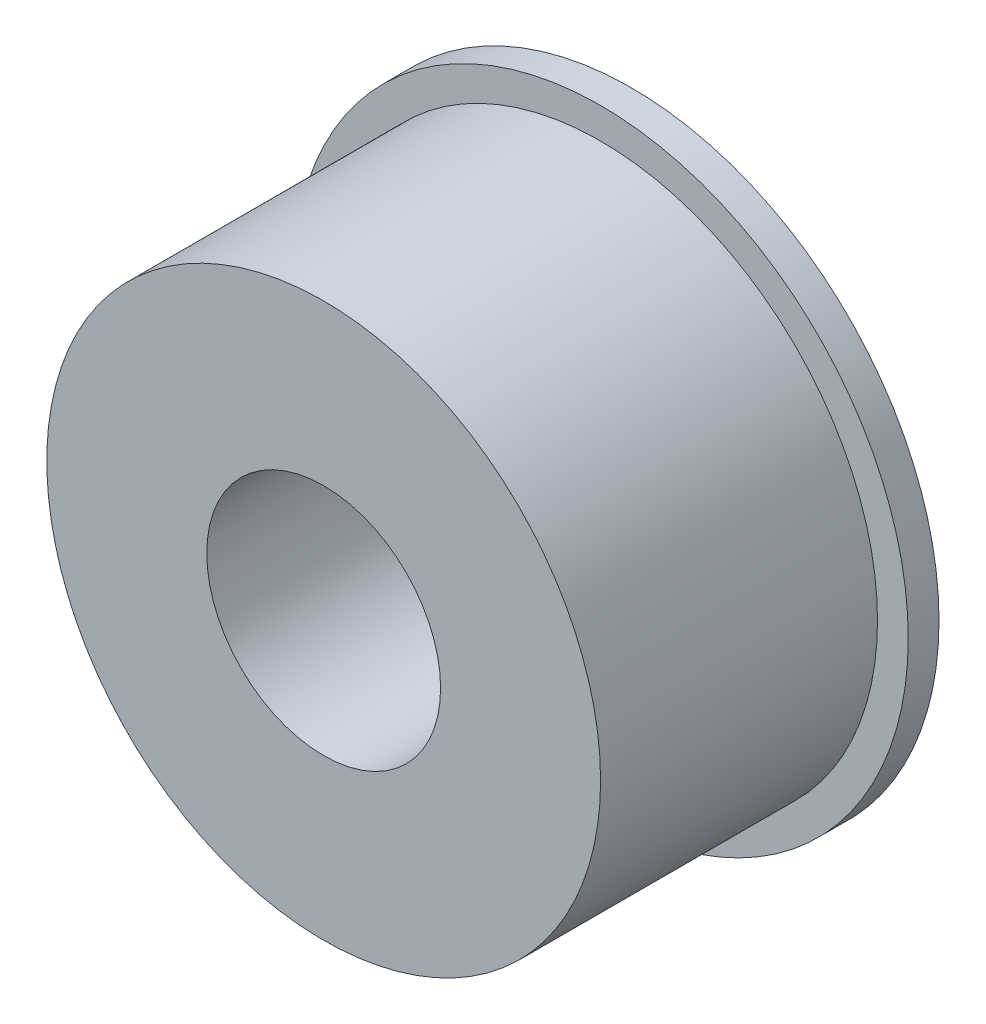
ISO-10303-21;
HEADER;
FILE_DESCRIPTION(('STEP AP214'),'2;1');
FILE_NAME('part.step','',(''),(''),'','','');
FILE_SCHEMA(('AUTOMOTIVE_DESIGN { 1 0 10303 214 1 1 1 1 }'));
ENDSEC;
DATA;
#1=APPLICATION_CONTEXT('core data for automotive mechanical design processes');
#2=APPLICATION_PROTOCOL_DEFINITION('international standard','automotive_design',2000,#1);
#3=PRODUCT_CONTEXT('',#1,'mechanical');
#4=PRODUCT('Part','Part','',(#3));
#5=PRODUCT_RELATED_PRODUCT_CATEGORY('part','',(#4));
#6=PRODUCT_DEFINITION_FORMATION('','',#4);
#7=PRODUCT_DEFINITION_CONTEXT('part definition',#1,'design');
#8=PRODUCT_DEFINITION('design','',#6,#7);
#9=PRODUCT_DEFINITION_SHAPE('','',#8);
#10=(LENGTH_UNIT() NAMED_UNIT(*) SI_UNIT(.MILLI.,.METRE.));
#11=(NAMED_UNIT(*) PLANE_ANGLE_UNIT() SI_UNIT($,.RADIAN.));
#12=(NAMED_UNIT(*) SI_UNIT($,.STERADIAN.) SOLID_ANGLE_UNIT());
#13=UNCERTAINTY_MEASURE_WITH_UNIT(LENGTH_MEASURE(1.E-05),#10,'distance_accuracy_value','');
#14=(GEOMETRIC_REPRESENTATION_CONTEXT(3) GLOBAL_UNCERTAINTY_ASSIGNED_CONTEXT((#13)) GLOBAL_UNIT_ASSIGNED_CONTEXT((#10,
#11,#12)) REPRESENTATION_CONTEXT('',''));
#15=CARTESIAN_POINT('',(0.,0.,0.));
#16=DIRECTION('',(0.,0.,1.));
#17=DIRECTION('',(1.,0.,0.));
#18=AXIS2_PLACEMENT_3D('',#15,#16,#17);
#19=CARTESIAN_POINT('',(0.,0.,2.54));
#20=DIRECTION('',(0.,0.,-1.));
#21=DIRECTION('',(-1.,0.,0.));
#22=AXIS2_PLACEMENT_3D('',#19,#20,#21);
#23=CYLINDRICAL_SURFACE('',#22,25.4);
#24=CARTESIAN_POINT('',(0.,0.,2.54));
#25=DIRECTION('',(0.,0.,1.));
#26=DIRECTION('',(1.,0.,0.));
#27=AXIS2_PLACEMENT_3D('',#24,#25,#26);
#28=CIRCLE('',#27,25.4);
#29=CARTESIAN_POINT('',(25.4,0.,2.54));
#30=VERTEX_POINT('',#29);
#31=EDGE_CURVE('E45',#30,#30,#28,.T.);
#32=ORIENTED_EDGE('',*,*,#31,.F.);
#33=EDGE_LOOP('',(#32));
#34=FACE_BOUND('',#33,.T.);
#35=CARTESIAN_POINT('',(0.,0.,0.));
#36=DIRECTION('',(0.,0.,1.));
#37=DIRECTION('',(1.,0.,0.));
#38=AXIS2_PLACEMENT_3D('',#35,#36,#37);
#39=CIRCLE('',#38,25.4);
#40=CARTESIAN_POINT('',(25.4,0.,0.));
#41=VERTEX_POINT('',#40);
#42=EDGE_CURVE('E40',#41,#41,#39,.T.);
#43=ORIENTED_EDGE('',*,*,#42,.T.);
#44=EDGE_LOOP('',(#43));
#45=FACE_BOUND('',#44,.T.);
#46=ADVANCED_FACE('F37',(#34,#45),#23,.T.);
#47=CARTESIAN_POINT('',(0.,0.,2.54));
#48=DIRECTION('',(0.,0.,1.));
#49=DIRECTION('',(1.,0.,0.));
#50=AXIS2_PLACEMENT_3D('',#47,#48,#49);
#51=PLANE('',#50);
#52=CARTESIAN_POINT('',(0.,0.,2.54));
#53=DIRECTION('',(0.,0.,1.));
#54=DIRECTION('',(1.,0.,0.));
#55=AXIS2_PLACEMENT_3D('',#52,#53,#54);
#56=CIRCLE('',#55,22.86);
#57=CARTESIAN_POINT('',(22.86,0.,2.54));
#58=VERTEX_POINT('',#57);
#59=EDGE_CURVE('E10',#58,#58,#56,.T.);
#60=ORIENTED_EDGE('',*,*,#59,.F.);
#61=EDGE_LOOP('',(#60));
#62=FACE_BOUND('',#61,.T.);
#63=ORIENTED_EDGE('',*,*,#31,.T.);
#64=EDGE_LOOP('',(#63));
#65=FACE_BOUND('',#64,.T.);
#66=ADVANCED_FACE('F81',(#62,#65),#51,.T.);
#67=CARTESIAN_POINT('',(0.,0.,0.));
#68=DIRECTION('',(0.,0.,1.));
#69=DIRECTION('',(1.,0.,0.));
#70=AXIS2_PLACEMENT_3D('',#67,#68,#69);
#71=PLANE('',#70);
#72=CARTESIAN_POINT('',(0.,0.,0.));
#73=DIRECTION('',(0.,0.,1.));
#74=DIRECTION('',(1.,0.,0.));
#75=AXIS2_PLACEMENT_3D('',#72,#73,#74);
#76=CIRCLE('',#75,9.652);
#77=CARTESIAN_POINT('',(9.652,0.,0.));
#78=VERTEX_POINT('',#77);
#79=EDGE_CURVE('E56',#78,#78,#76,.T.);
#80=ORIENTED_EDGE('',*,*,#79,.T.);
#81=EDGE_LOOP('',(#80));
#82=FACE_BOUND('',#81,.T.);
#83=ORIENTED_EDGE('',*,*,#42,.F.);
#84=EDGE_LOOP('',(#83));
#85=FACE_BOUND('',#84,.T.);
#86=ADVANCED_FACE('F76',(#82,#85),#71,.F.);
#87=CARTESIAN_POINT('',(0.,0.,25.4));
#88=DIRECTION('',(0.,0.,-1.));
#89=DIRECTION('',(-1.,0.,0.));
#90=AXIS2_PLACEMENT_3D('',#87,#88,#89);
#91=CYLINDRICAL_SURFACE('',#90,22.86);
#92=CARTESIAN_POINT('',(0.,0.,25.4));
#93=DIRECTION('',(0.,0.,1.));
#94=DIRECTION('',(1.,0.,0.));
#95=AXIS2_PLACEMENT_3D('',#92,#93,#94);
#96=CIRCLE('',#95,22.86);
#97=CARTESIAN_POINT('',(22.86,0.,25.4));
#98=VERTEX_POINT('',#97);
#99=EDGE_CURVE('E52',#98,#98,#96,.T.);
#100=ORIENTED_EDGE('',*,*,#99,.F.);
#101=EDGE_LOOP('',(#100));
#102=FACE_BOUND('',#101,.T.);
#103=ORIENTED_EDGE('',*,*,#59,.T.);
#104=EDGE_LOOP('',(#103));
#105=FACE_BOUND('',#104,.T.);
#106=ADVANCED_FACE('F71',(#102,#105),#91,.T.);
#107=CARTESIAN_POINT('',(0.,0.,25.4));
#108=DIRECTION('',(0.,0.,1.));
#109=DIRECTION('',(1.,0.,0.));
#110=AXIS2_PLACEMENT_3D('',#107,#108,#109);
#111=PLANE('',#110);
#112=CARTESIAN_POINT('',(0.,0.,25.4));
#113=DIRECTION('',(0.,0.,1.));
#114=DIRECTION('',(1.,0.,0.));
#115=AXIS2_PLACEMENT_3D('',#112,#113,#114);
#116=CIRCLE('',#115,9.652);
#117=CARTESIAN_POINT('',(9.652,0.,25.4));
#118=VERTEX_POINT('',#117);
#119=EDGE_CURVE('E60',#118,#118,#116,.T.);
#120=ORIENTED_EDGE('',*,*,#119,.F.);
#121=EDGE_LOOP('',(#120));
#122=FACE_BOUND('',#121,.T.);
#123=ORIENTED_EDGE('',*,*,#99,.T.);
#124=EDGE_LOOP('',(#123));
#125=FACE_BOUND('',#124,.T.);
#126=ADVANCED_FACE('F68',(#122,#125),#111,.T.);
#127=CARTESIAN_POINT('',(0.,0.,-5.334));
#128=DIRECTION('',(0.,0.,1.));
#129=DIRECTION('',(1.,0.,0.));
#130=AXIS2_PLACEMENT_3D('',#127,#128,#129);
#131=CYLINDRICAL_SURFACE('',#130,9.652);
#132=CARTESIAN_POINT('',(9.652,0.,25.4));
#133=CARTESIAN_POINT('',(9.652,0.,25.1354166666667));
#134=CARTESIAN_POINT('',(9.652,0.,24.8708333333333));
#135=CARTESIAN_POINT('',(9.652,0.,24.3416666666667));
#136=CARTESIAN_POINT('',(9.652,0.,24.0770833333333));
#137=CARTESIAN_POINT('',(9.652,0.,23.5479166666667));
#138=CARTESIAN_POINT('',(9.652,0.,23.2833333333333));
#139=CARTESIAN_POINT('',(9.652,0.,22.7541666666667));
#140=CARTESIAN_POINT('',(9.652,0.,22.4895833333333));
#141=CARTESIAN_POINT('',(9.652,0.,21.9604166666667));
#142=CARTESIAN_POINT('',(9.652,0.,21.6958333333333));
#143=CARTESIAN_POINT('',(9.652,0.,21.1666666666667));
#144=CARTESIAN_POINT('',(9.652,0.,20.9020833333333));
#145=CARTESIAN_POINT('',(9.652,0.,20.3729166666667));
#146=CARTESIAN_POINT('',(9.652,0.,20.1083333333333));
#147=CARTESIAN_POINT('',(9.652,0.,19.5791666666667));
#148=CARTESIAN_POINT('',(9.652,0.,19.3145833333333));
#149=CARTESIAN_POINT('',(9.652,0.,18.7854166666667));
#150=CARTESIAN_POINT('',(9.652,0.,18.5208333333333));
#151=CARTESIAN_POINT('',(9.652,0.,17.9916666666667));
#152=CARTESIAN_POINT('',(9.652,0.,17.7270833333333));
#153=CARTESIAN_POINT('',(9.652,0.,17.1979166666667));
#154=CARTESIAN_POINT('',(9.652,0.,16.9333333333333));
#155=CARTESIAN_POINT('',(9.652,0.,16.4041666666667));
#156=CARTESIAN_POINT('',(9.652,0.,16.1395833333333));
#157=CARTESIAN_POINT('',(9.652,0.,15.6104166666667));
#158=CARTESIAN_POINT('',(9.652,0.,15.3458333333333));
#159=CARTESIAN_POINT('',(9.652,0.,14.8166666666667));
#160=CARTESIAN_POINT('',(9.652,0.,14.5520833333333));
#161=CARTESIAN_POINT('',(9.652,0.,14.0229166666667));
#162=CARTESIAN_POINT('',(9.652,0.,13.7583333333333));
#163=CARTESIAN_POINT('',(9.652,0.,13.2291666666667));
#164=CARTESIAN_POINT('',(9.652,0.,12.9645833333333));
#165=CARTESIAN_POINT('',(9.652,0.,12.4354166666667));
#166=CARTESIAN_POINT('',(9.652,0.,12.1708333333333));
#167=CARTESIAN_POINT('',(9.652,0.,11.6416666666667));
#168=CARTESIAN_POINT('',(9.652,0.,11.3770833333333));
#169=CARTESIAN_POINT('',(9.652,0.,10.8479166666667));
#170=CARTESIAN_POINT('',(9.652,0.,10.5833333333333));
#171=CARTESIAN_POINT('',(9.652,0.,10.0541666666667));
#172=CARTESIAN_POINT('',(9.652,0.,9.78958333333333));
#173=CARTESIAN_POINT('',(9.652,0.,9.26041666666667));
#174=CARTESIAN_POINT('',(9.652,0.,8.99583333333333));
#175=CARTESIAN_POINT('',(9.652,0.,8.46666666666666));
#176=CARTESIAN_POINT('',(9.652,0.,8.20208333333333));
#177=CARTESIAN_POINT('',(9.652,0.,7.67291666666667));
#178=CARTESIAN_POINT('',(9.652,0.,7.40833333333333));
#179=CARTESIAN_POINT('',(9.652,0.,6.87916666666667));
#180=CARTESIAN_POINT('',(9.652,0.,6.61458333333333));
#181=CARTESIAN_POINT('',(9.652,0.,6.08541666666667));
#182=CARTESIAN_POINT('',(9.652,0.,5.82083333333333));
#183=CARTESIAN_POINT('',(9.652,0.,5.29166666666667));
#184=CARTESIAN_POINT('',(9.652,0.,5.02708333333333));
#185=CARTESIAN_POINT('',(9.652,0.,4.49791666666667));
#186=CARTESIAN_POINT('',(9.652,0.,4.23333333333333));
#187=CARTESIAN_POINT('',(9.652,0.,3.70416666666667));
#188=CARTESIAN_POINT('',(9.652,0.,3.43958333333333));
#189=CARTESIAN_POINT('',(9.652,0.,2.91041666666667));
#190=CARTESIAN_POINT('',(9.652,0.,2.64583333333333));
#191=CARTESIAN_POINT('',(9.652,0.,2.11666666666667));
#192=CARTESIAN_POINT('',(9.652,0.,1.85208333333333));
#193=CARTESIAN_POINT('',(9.652,0.,1.32291666666666));
#194=CARTESIAN_POINT('',(9.652,0.,1.05833333333333));
#195=CARTESIAN_POINT('',(9.652,0.,0.529166666666665));
#196=CARTESIAN_POINT('',(9.652,0.,0.264583333333332));
#197=CARTESIAN_POINT('',(9.652,0.,0.));
#198=B_SPLINE_CURVE_WITH_KNOTS('',3,(#132,#133,#134,#135,#136,#137,#138,#139,#140,#141,#142,
#143,#144,#145,#146,#147,#148,#149,#150,#151,#152,#153,#154,#155,#156,#157,#158,#159,#160,#161,
#162,#163,#164,#165,#166,#167,#168,#169,#170,#171,#172,#173,#174,#175,#176,#177,#178,#179,#180,
#181,#182,#183,#184,#185,#186,#187,#188,#189,#190,#191,#192,#193,#194,#195,#196,#197),
.UNSPECIFIED.,.F.,.F.,(4,2,2,2,2,2,2,2,2,2,2,2,2,2,2,2,2,2,2,2,2,2,2,2,2,2,2,2,2,2,2,2,4),(0.,
0.793749999999999,1.5875,2.38125,3.175,3.96875,4.7625,5.55625,6.35,7.14375,7.9375,8.73125,9.525,
10.31875,11.1125,11.90625,12.7,13.49375,14.2875,15.08125,15.875,16.66875,17.4625,18.25625,19.05,
19.84375,20.6375,21.43125,22.225,23.01875,23.8125,24.60625,25.4),.UNSPECIFIED.);
#199=EDGE_CURVE('BSEAM65',#118,#78,#198,.T.);
#200=ORIENTED_EDGE('',*,*,#119,.T.);
#201=ORIENTED_EDGE('',*,*,#79,.F.);
#202=ORIENTED_EDGE('',*,*,#199,.T.);
#203=ORIENTED_EDGE('',*,*,#199,.F.);
#204=EDGE_LOOP('',(#200,#202,#201,#203));
#205=FACE_BOUND('',#204,.T.);
#206=ADVANCED_FACE('F65',(#205),#131,.F.);
#207=CLOSED_SHELL('',(#46,#66,#86,#106,#126,#206));
#208=MANIFOLD_SOLID_BREP('B2',#207);
#209=ADVANCED_BREP_SHAPE_REPRESENTATION('',(#18,#208),#14);
#210=SHAPE_DEFINITION_REPRESENTATION(#9,#209);
ENDSEC;
END-ISO-10303-21;
